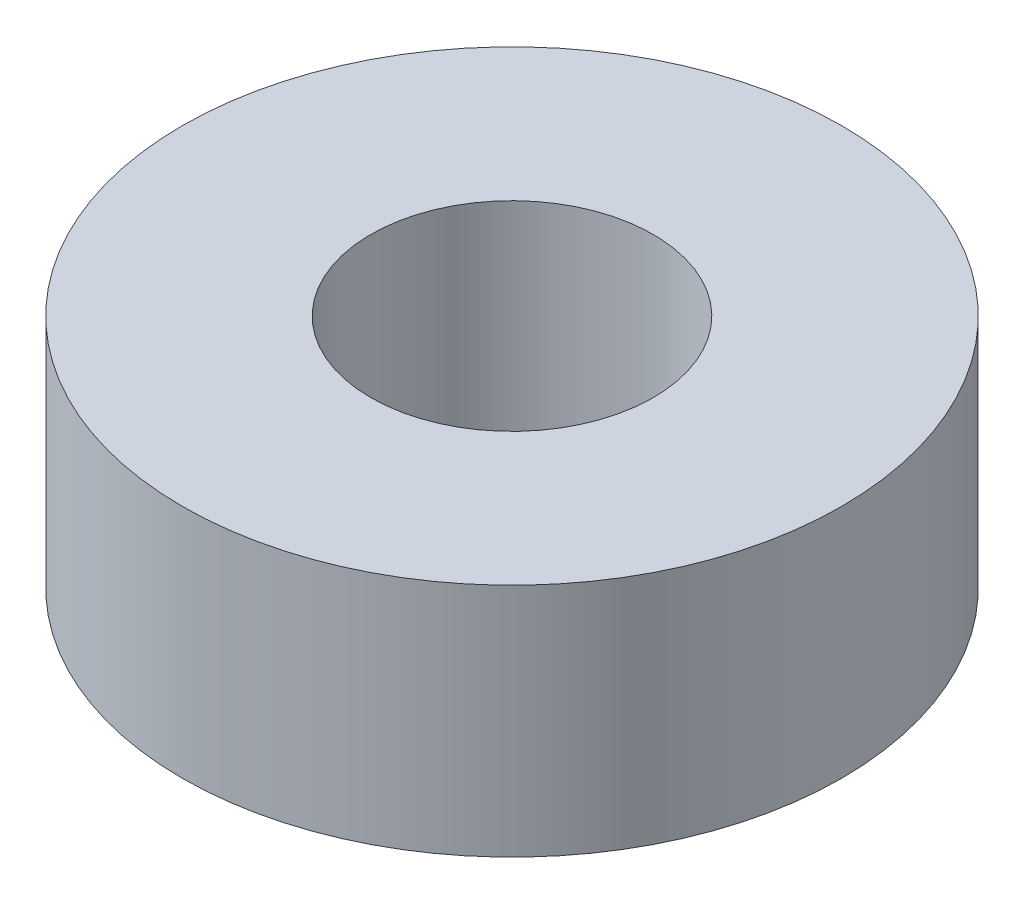
ISO-10303-21;
HEADER;
FILE_DESCRIPTION(('STEP AP214'),'2;1');
FILE_NAME('part.step','',(''),(''),'','','');
FILE_SCHEMA(('AUTOMOTIVE_DESIGN { 1 0 10303 214 1 1 1 1 }'));
ENDSEC;
DATA;
#1=APPLICATION_CONTEXT('core data for automotive mechanical design processes');
#2=APPLICATION_PROTOCOL_DEFINITION('international standard','automotive_design',2000,#1);
#3=PRODUCT_CONTEXT('',#1,'mechanical');
#4=PRODUCT('Part','Part','',(#3));
#5=PRODUCT_RELATED_PRODUCT_CATEGORY('part','',(#4));
#6=PRODUCT_DEFINITION_FORMATION('','',#4);
#7=PRODUCT_DEFINITION_CONTEXT('part definition',#1,'design');
#8=PRODUCT_DEFINITION('design','',#6,#7);
#9=PRODUCT_DEFINITION_SHAPE('','',#8);
#10=(LENGTH_UNIT() NAMED_UNIT(*) SI_UNIT(.MILLI.,.METRE.));
#11=(NAMED_UNIT(*) PLANE_ANGLE_UNIT() SI_UNIT($,.RADIAN.));
#12=(NAMED_UNIT(*) SI_UNIT($,.STERADIAN.) SOLID_ANGLE_UNIT());
#13=UNCERTAINTY_MEASURE_WITH_UNIT(LENGTH_MEASURE(1.E-05),#10,'distance_accuracy_value','');
#14=(GEOMETRIC_REPRESENTATION_CONTEXT(3) GLOBAL_UNCERTAINTY_ASSIGNED_CONTEXT((#13)) GLOBAL_UNIT_ASSIGNED_CONTEXT((#10,
#11,#12)) REPRESENTATION_CONTEXT('',''));
#15=CARTESIAN_POINT('',(0.,0.,0.));
#16=DIRECTION('',(0.,0.,1.));
#17=DIRECTION('',(1.,0.,0.));
#18=AXIS2_PLACEMENT_3D('',#15,#16,#17);
#19=CARTESIAN_POINT('',(0.,5.,0.));
#20=DIRECTION('',(0.,1.,0.));
#21=DIRECTION('',(0.,0.,1.));
#22=AXIS2_PLACEMENT_3D('',#19,#20,#21);
#23=PLANE('',#22);
#24=CARTESIAN_POINT('',(0.,5.,0.));
#25=DIRECTION('',(0.,1.,0.));
#26=DIRECTION('',(0.,0.,1.));
#27=AXIS2_PLACEMENT_3D('',#24,#25,#26);
#28=CIRCLE('',#27,7.);
#29=CARTESIAN_POINT('',(0.,5.,7.));
#30=VERTEX_POINT('',#29);
#31=EDGE_CURVE('E10',#30,#30,#28,.T.);
#32=ORIENTED_EDGE('',*,*,#31,.T.);
#33=EDGE_LOOP('',(#32));
#34=FACE_BOUND('',#33,.T.);
#35=CARTESIAN_POINT('',(0.,5.,0.));
#36=DIRECTION('',(0.,1.,0.));
#37=DIRECTION('',(0.,0.,1.));
#38=AXIS2_PLACEMENT_3D('',#35,#36,#37);
#39=CIRCLE('',#38,3.);
#40=CARTESIAN_POINT('',(0.,5.,3.));
#41=VERTEX_POINT('',#40);
#42=EDGE_CURVE('E44',#41,#41,#39,.T.);
#43=ORIENTED_EDGE('',*,*,#42,.F.);
#44=EDGE_LOOP('',(#43));
#45=FACE_BOUND('',#44,.T.);
#46=ADVANCED_FACE('F33',(#34,#45),#23,.T.);
#47=CARTESIAN_POINT('',(0.,0.,0.));
#48=DIRECTION('',(0.,1.,0.));
#49=DIRECTION('',(0.,0.,1.));
#50=AXIS2_PLACEMENT_3D('',#47,#48,#49);
#51=PLANE('',#50);
#52=CARTESIAN_POINT('',(0.,0.,0.));
#53=DIRECTION('',(0.,1.,0.));
#54=DIRECTION('',(0.,0.,1.));
#55=AXIS2_PLACEMENT_3D('',#52,#53,#54);
#56=CIRCLE('',#55,7.);
#57=CARTESIAN_POINT('',(0.,0.,7.));
#58=VERTEX_POINT('',#57);
#59=EDGE_CURVE('E37',#58,#58,#56,.T.);
#60=ORIENTED_EDGE('',*,*,#59,.F.);
#61=EDGE_LOOP('',(#60));
#62=FACE_BOUND('',#61,.T.);
#63=CARTESIAN_POINT('',(0.,0.,0.));
#64=DIRECTION('',(0.,1.,0.));
#65=DIRECTION('',(0.,0.,1.));
#66=AXIS2_PLACEMENT_3D('',#63,#64,#65);
#67=CIRCLE('',#66,3.);
#68=CARTESIAN_POINT('',(0.,0.,3.));
#69=VERTEX_POINT('',#68);
#70=EDGE_CURVE('E46',#69,#69,#67,.T.);
#71=ORIENTED_EDGE('',*,*,#70,.T.);
#72=EDGE_LOOP('',(#71));
#73=FACE_BOUND('',#72,.T.);
#74=ADVANCED_FACE('F56',(#62,#73),#51,.F.);
#75=CARTESIAN_POINT('',(0.,5.,0.));
#76=DIRECTION('',(0.,-1.,0.));
#77=DIRECTION('',(0.,0.,-1.));
#78=AXIS2_PLACEMENT_3D('',#75,#76,#77);
#79=CYLINDRICAL_SURFACE('',#78,7.);
#80=ORIENTED_EDGE('',*,*,#31,.F.);
#81=EDGE_LOOP('',(#80));
#82=FACE_BOUND('',#81,.T.);
#83=ORIENTED_EDGE('',*,*,#59,.T.);
#84=EDGE_LOOP('',(#83));
#85=FACE_BOUND('',#84,.T.);
#86=ADVANCED_FACE('F35',(#82,#85),#79,.T.);
#87=CARTESIAN_POINT('',(0.,5.,0.));
#88=DIRECTION('',(0.,-1.,0.));
#89=DIRECTION('',(0.,0.,-1.));
#90=AXIS2_PLACEMENT_3D('',#87,#88,#89);
#91=CYLINDRICAL_SURFACE('',#90,3.);
#92=ORIENTED_EDGE('',*,*,#42,.T.);
#93=EDGE_LOOP('',(#92));
#94=FACE_BOUND('',#93,.T.);
#95=ORIENTED_EDGE('',*,*,#70,.F.);
#96=EDGE_LOOP('',(#95));
#97=FACE_BOUND('',#96,.T.);
#98=ADVANCED_FACE('F52',(#94,#97),#91,.F.);
#99=CLOSED_SHELL('',(#46,#74,#86,#98));
#100=MANIFOLD_SOLID_BREP('B2',#99);
#101=ADVANCED_BREP_SHAPE_REPRESENTATION('',(#18,#100),#14);
#102=SHAPE_DEFINITION_REPRESENTATION(#9,#101);
ENDSEC;
END-ISO-10303-21;
